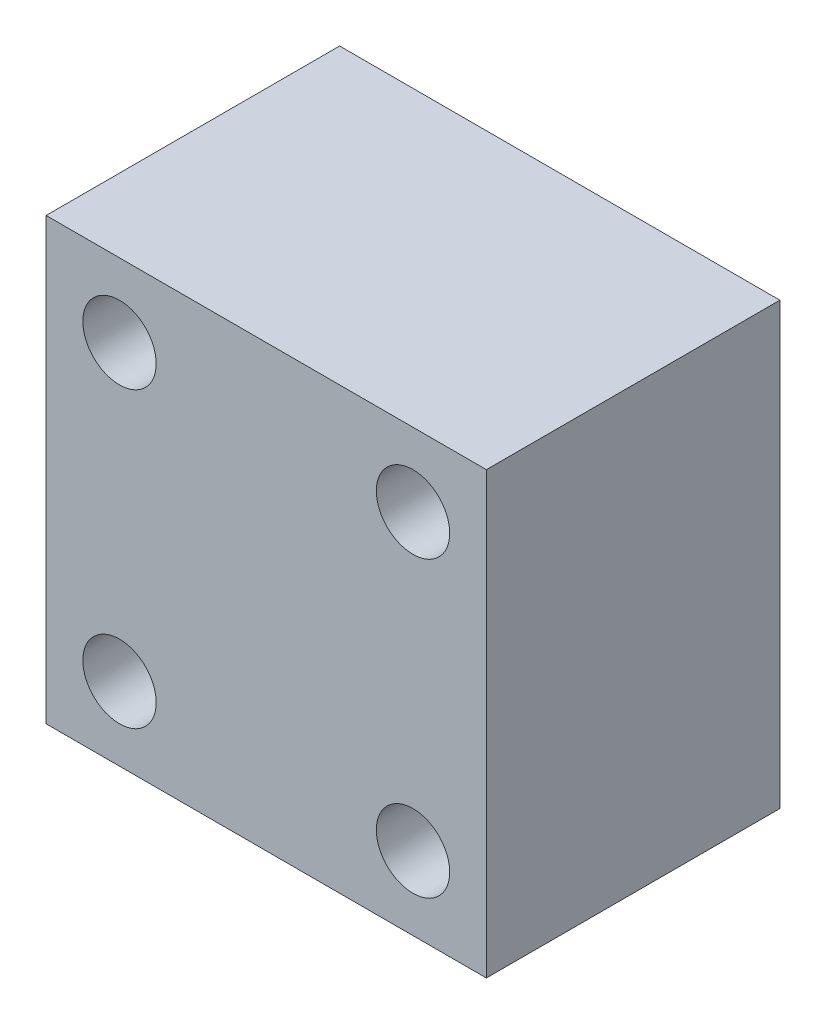
ISO-10303-21;
HEADER;
FILE_DESCRIPTION(('STEP AP214'),'2;1');
FILE_NAME('part.step','',(''),(''),'','','');
FILE_SCHEMA(('AUTOMOTIVE_DESIGN { 1 0 10303 214 1 1 1 1 }'));
ENDSEC;
DATA;
#1=APPLICATION_CONTEXT('core data for automotive mechanical design processes');
#2=APPLICATION_PROTOCOL_DEFINITION('international standard','automotive_design',2000,#1);
#3=PRODUCT_CONTEXT('',#1,'mechanical');
#4=PRODUCT('Part','Part','',(#3));
#5=PRODUCT_RELATED_PRODUCT_CATEGORY('part','',(#4));
#6=PRODUCT_DEFINITION_FORMATION('','',#4);
#7=PRODUCT_DEFINITION_CONTEXT('part definition',#1,'design');
#8=PRODUCT_DEFINITION('design','',#6,#7);
#9=PRODUCT_DEFINITION_SHAPE('','',#8);
#10=(LENGTH_UNIT() NAMED_UNIT(*) SI_UNIT(.MILLI.,.METRE.));
#11=(NAMED_UNIT(*) PLANE_ANGLE_UNIT() SI_UNIT($,.RADIAN.));
#12=(NAMED_UNIT(*) SI_UNIT($,.STERADIAN.) SOLID_ANGLE_UNIT());
#13=UNCERTAINTY_MEASURE_WITH_UNIT(LENGTH_MEASURE(1.E-05),#10,'distance_accuracy_value','');
#14=(GEOMETRIC_REPRESENTATION_CONTEXT(3) GLOBAL_UNCERTAINTY_ASSIGNED_CONTEXT((#13)) GLOBAL_UNIT_ASSIGNED_CONTEXT((#10,
#11,#12)) REPRESENTATION_CONTEXT('',''));
#15=CARTESIAN_POINT('',(0.,0.,0.));
#16=DIRECTION('',(0.,0.,1.));
#17=DIRECTION('',(1.,0.,0.));
#18=AXIS2_PLACEMENT_3D('',#15,#16,#17);
#19=CARTESIAN_POINT('',(0.,0.,40.));
#20=DIRECTION('',(0.,0.,1.));
#21=DIRECTION('',(1.,0.,0.));
#22=AXIS2_PLACEMENT_3D('',#19,#20,#21);
#23=PLANE('',#22);
#24=CARTESIAN_POINT('',(25.4980079681275,12.3505976095618,40.));
#25=DIRECTION('',(0.,0.,1.));
#26=DIRECTION('',(1.,0.,0.));
#27=AXIS2_PLACEMENT_3D('',#24,#25,#26);
#28=CIRCLE('',#27,5.);
#29=CARTESIAN_POINT('',(30.4980079681275,12.3505976095618,40.));
#30=VERTEX_POINT('',#29);
#31=EDGE_CURVE('E129',#30,#30,#28,.F.);
#32=ORIENTED_EDGE('',*,*,#31,.T.);
#33=EDGE_LOOP('',(#32));
#34=FACE_BOUND('',#33,.T.);
#35=CARTESIAN_POINT('',(-14.5019920318725,-27.6494023904383,40.));
#36=DIRECTION('',(0.,0.,1.));
#37=DIRECTION('',(1.,0.,0.));
#38=AXIS2_PLACEMENT_3D('',#35,#36,#37);
#39=CIRCLE('',#38,5.);
#40=CARTESIAN_POINT('',(-9.5019920318725,-27.6494023904383,40.));
#41=VERTEX_POINT('',#40);
#42=EDGE_CURVE('E117',#41,#41,#39,.F.);
#43=ORIENTED_EDGE('',*,*,#42,.T.);
#44=EDGE_LOOP('',(#43));
#45=FACE_BOUND('',#44,.T.);
#46=CARTESIAN_POINT('',(-14.5019920318725,12.3505976095618,40.));
#47=DIRECTION('',(0.,0.,1.));
#48=DIRECTION('',(1.,0.,0.));
#49=AXIS2_PLACEMENT_3D('',#46,#47,#48);
#50=CIRCLE('',#49,5.);
#51=CARTESIAN_POINT('',(-9.5019920318725,12.3505976095618,40.));
#52=VERTEX_POINT('',#51);
#53=EDGE_CURVE('E111',#52,#52,#50,.T.);
#54=ORIENTED_EDGE('',*,*,#53,.F.);
#55=EDGE_LOOP('',(#54));
#56=FACE_BOUND('',#55,.T.);
#57=DIRECTION('',(0.,-1.,0.));
#58=VECTOR('',#57,1.);
#59=CARTESIAN_POINT('',(-24.5019920318725,22.3505976095617,40.));
#60=LINE('',#59,#58);
#61=CARTESIAN_POINT('',(-24.5019920318725,22.3505976095617,40.));
#62=VERTEX_POINT('',#61);
#63=CARTESIAN_POINT('',(-24.5019920318725,-37.6494023904382,40.));
#64=VERTEX_POINT('',#63);
#65=EDGE_CURVE('E85',#62,#64,#60,.T.);
#66=ORIENTED_EDGE('',*,*,#65,.T.);
#67=DIRECTION('',(1.,0.,0.));
#68=VECTOR('',#67,1.);
#69=CARTESIAN_POINT('',(-24.5019920318725,-37.6494023904382,40.));
#70=LINE('',#69,#68);
#71=CARTESIAN_POINT('',(35.4980079681275,-37.6494023904382,40.));
#72=VERTEX_POINT('',#71);
#73=EDGE_CURVE('E80',#64,#72,#70,.T.);
#74=ORIENTED_EDGE('',*,*,#73,.T.);
#75=DIRECTION('',(0.,1.,0.));
#76=VECTOR('',#75,1.);
#77=CARTESIAN_POINT('',(35.4980079681275,22.3505976095617,40.));
#78=LINE('',#77,#76);
#79=CARTESIAN_POINT('',(35.4980079681275,22.3505976095617,40.));
#80=VERTEX_POINT('',#79);
#81=EDGE_CURVE('E83',#72,#80,#78,.T.);
#82=ORIENTED_EDGE('',*,*,#81,.T.);
#83=DIRECTION('',(-1.,0.,0.));
#84=VECTOR('',#83,1.);
#85=CARTESIAN_POINT('',(-24.5019920318725,22.3505976095617,40.));
#86=LINE('',#85,#84);
#87=EDGE_CURVE('E50',#80,#62,#86,.T.);
#88=ORIENTED_EDGE('',*,*,#87,.T.);
#89=EDGE_LOOP('',(#66,#74,#82,#88));
#90=FACE_BOUND('',#89,.T.);
#91=CARTESIAN_POINT('',(25.4980079681275,-27.6494023904383,40.));
#92=DIRECTION('',(0.,0.,1.));
#93=DIRECTION('',(1.,0.,0.));
#94=AXIS2_PLACEMENT_3D('',#91,#92,#93);
#95=CIRCLE('',#94,5.);
#96=CARTESIAN_POINT('',(30.4980079681275,-27.6494023904383,40.));
#97=VERTEX_POINT('',#96);
#98=EDGE_CURVE('E123',#97,#97,#95,.T.);
#99=ORIENTED_EDGE('',*,*,#98,.F.);
#100=EDGE_LOOP('',(#99));
#101=FACE_BOUND('',#100,.T.);
#102=ADVANCED_FACE('F33',(#34,#45,#56,#90,#101),#23,.T.);
#103=CARTESIAN_POINT('',(-24.5019920318725,22.3505976095617,40.));
#104=DIRECTION('',(1.,0.,0.));
#105=DIRECTION('',(0.,0.,-1.));
#106=AXIS2_PLACEMENT_3D('',#103,#104,#105);
#107=PLANE('',#106);
#108=DIRECTION('',(0.,-1.,0.));
#109=VECTOR('',#108,1.);
#110=CARTESIAN_POINT('',(-24.5019920318725,22.3505976095617,0.));
#111=LINE('',#110,#109);
#112=CARTESIAN_POINT('',(-24.5019920318725,22.3505976095617,0.));
#113=VERTEX_POINT('',#112);
#114=CARTESIAN_POINT('',(-24.5019920318725,-37.6494023904382,0.));
#115=VERTEX_POINT('',#114);
#116=EDGE_CURVE('E97',#113,#115,#111,.T.);
#117=ORIENTED_EDGE('',*,*,#116,.T.);
#118=DIRECTION('',(0.,0.,-1.));
#119=VECTOR('',#118,1.);
#120=CARTESIAN_POINT('',(-24.5019920318725,-37.6494023904382,40.));
#121=LINE('',#120,#119);
#122=EDGE_CURVE('E11',#64,#115,#121,.T.);
#123=ORIENTED_EDGE('',*,*,#122,.F.);
#124=ORIENTED_EDGE('',*,*,#65,.F.);
#125=DIRECTION('',(0.,0.,-1.));
#126=VECTOR('',#125,1.);
#127=CARTESIAN_POINT('',(-24.5019920318725,22.3505976095617,40.));
#128=LINE('',#127,#126);
#129=EDGE_CURVE('E93',#62,#113,#128,.T.);
#130=ORIENTED_EDGE('',*,*,#129,.T.);
#131=EDGE_LOOP('',(#117,#123,#124,#130));
#132=FACE_BOUND('',#131,.T.);
#133=ADVANCED_FACE('F35',(#132),#107,.F.);
#134=CARTESIAN_POINT('',(-24.5019920318725,-37.6494023904382,40.));
#135=DIRECTION('',(0.,1.,0.));
#136=DIRECTION('',(0.,0.,1.));
#137=AXIS2_PLACEMENT_3D('',#134,#135,#136);
#138=PLANE('',#137);
#139=DIRECTION('',(1.,0.,0.));
#140=VECTOR('',#139,1.);
#141=CARTESIAN_POINT('',(-24.5019920318725,-37.6494023904382,0.));
#142=LINE('',#141,#140);
#143=CARTESIAN_POINT('',(35.4980079681275,-37.6494023904382,0.));
#144=VERTEX_POINT('',#143);
#145=EDGE_CURVE('E89',#115,#144,#142,.T.);
#146=ORIENTED_EDGE('',*,*,#145,.T.);
#147=DIRECTION('',(0.,0.,-1.));
#148=VECTOR('',#147,1.);
#149=CARTESIAN_POINT('',(35.4980079681275,-37.6494023904382,40.));
#150=LINE('',#149,#148);
#151=EDGE_CURVE('E42',#72,#144,#150,.T.);
#152=ORIENTED_EDGE('',*,*,#151,.F.);
#153=ORIENTED_EDGE('',*,*,#73,.F.);
#154=ORIENTED_EDGE('',*,*,#122,.T.);
#155=EDGE_LOOP('',(#146,#152,#153,#154));
#156=FACE_BOUND('',#155,.T.);
#157=ADVANCED_FACE('F88',(#156),#138,.F.);
#158=CARTESIAN_POINT('',(35.4980079681275,22.3505976095617,40.));
#159=DIRECTION('',(-1.,0.,0.));
#160=DIRECTION('',(0.,-1.,0.));
#161=AXIS2_PLACEMENT_3D('',#158,#159,#160);
#162=PLANE('',#161);
#163=DIRECTION('',(0.,1.,0.));
#164=VECTOR('',#163,1.);
#165=CARTESIAN_POINT('',(35.4980079681275,22.3505976095617,0.));
#166=LINE('',#165,#164);
#167=CARTESIAN_POINT('',(35.4980079681275,22.3505976095617,0.));
#168=VERTEX_POINT('',#167);
#169=EDGE_CURVE('E67',#144,#168,#166,.T.);
#170=ORIENTED_EDGE('',*,*,#169,.T.);
#171=DIRECTION('',(0.,0.,-1.));
#172=VECTOR('',#171,1.);
#173=CARTESIAN_POINT('',(35.4980079681275,22.3505976095617,40.));
#174=LINE('',#173,#172);
#175=EDGE_CURVE('E90',#80,#168,#174,.T.);
#176=ORIENTED_EDGE('',*,*,#175,.F.);
#177=ORIENTED_EDGE('',*,*,#81,.F.);
#178=ORIENTED_EDGE('',*,*,#151,.T.);
#179=EDGE_LOOP('',(#170,#176,#177,#178));
#180=FACE_BOUND('',#179,.T.);
#181=ADVANCED_FACE('F91',(#180),#162,.F.);
#182=CARTESIAN_POINT('',(-24.5019920318725,22.3505976095617,40.));
#183=DIRECTION('',(0.,-1.,0.));
#184=DIRECTION('',(0.,0.,-1.));
#185=AXIS2_PLACEMENT_3D('',#182,#183,#184);
#186=PLANE('',#185);
#187=DIRECTION('',(-1.,0.,0.));
#188=VECTOR('',#187,1.);
#189=CARTESIAN_POINT('',(-24.5019920318725,22.3505976095617,0.));
#190=LINE('',#189,#188);
#191=EDGE_CURVE('E73',#168,#113,#190,.T.);
#192=ORIENTED_EDGE('',*,*,#191,.T.);
#193=ORIENTED_EDGE('',*,*,#129,.F.);
#194=ORIENTED_EDGE('',*,*,#87,.F.);
#195=ORIENTED_EDGE('',*,*,#175,.T.);
#196=EDGE_LOOP('',(#192,#193,#194,#195));
#197=FACE_BOUND('',#196,.T.);
#198=ADVANCED_FACE('F105',(#197),#186,.F.);
#199=CARTESIAN_POINT('',(0.,0.,0.));
#200=DIRECTION('',(0.,0.,1.));
#201=DIRECTION('',(1.,0.,0.));
#202=AXIS2_PLACEMENT_3D('',#199,#200,#201);
#203=PLANE('',#202);
#204=ORIENTED_EDGE('',*,*,#116,.F.);
#205=ORIENTED_EDGE('',*,*,#191,.F.);
#206=ORIENTED_EDGE('',*,*,#169,.F.);
#207=ORIENTED_EDGE('',*,*,#145,.F.);
#208=EDGE_LOOP('',(#204,#205,#206,#207));
#209=FACE_BOUND('',#208,.T.);
#210=ADVANCED_FACE('F108',(#209),#203,.F.);
#211=CARTESIAN_POINT('',(-14.5019920318725,12.3505976095618,20.));
#212=DIRECTION('',(0.,0.,1.));
#213=DIRECTION('',(1.,0.,0.));
#214=AXIS2_PLACEMENT_3D('',#211,#212,#213);
#215=CYLINDRICAL_SURFACE('',#214,5.);
#216=CARTESIAN_POINT('',(-14.5019920318725,12.3505976095618,20.));
#217=DIRECTION('',(0.,0.,1.));
#218=DIRECTION('',(1.,0.,0.));
#219=AXIS2_PLACEMENT_3D('',#216,#217,#218);
#220=CIRCLE('',#219,5.);
#221=CARTESIAN_POINT('',(-9.5019920318725,12.3505976095618,20.));
#222=VERTEX_POINT('',#221);
#223=EDGE_CURVE('E100',#222,#222,#220,.T.);
#224=ORIENTED_EDGE('',*,*,#223,.F.);
#225=EDGE_LOOP('',(#224));
#226=FACE_BOUND('',#225,.T.);
#227=ORIENTED_EDGE('',*,*,#53,.T.);
#228=EDGE_LOOP('',(#227));
#229=FACE_BOUND('',#228,.T.);
#230=ADVANCED_FACE('F155',(#226,#229),#215,.F.);
#231=CARTESIAN_POINT('',(0.,0.,20.));
#232=DIRECTION('',(0.,0.,1.));
#233=DIRECTION('',(1.,0.,0.));
#234=AXIS2_PLACEMENT_3D('',#231,#232,#233);
#235=PLANE('',#234);
#236=ORIENTED_EDGE('',*,*,#223,.T.);
#237=EDGE_LOOP('',(#236));
#238=FACE_BOUND('',#237,.T.);
#239=ADVANCED_FACE('F185',(#238),#235,.T.);
#240=CARTESIAN_POINT('',(-14.5019920318725,-27.6494023904383,20.));
#241=DIRECTION('',(0.,0.,1.));
#242=DIRECTION('',(1.,0.,0.));
#243=AXIS2_PLACEMENT_3D('',#240,#241,#242);
#244=CYLINDRICAL_SURFACE('',#243,5.);
#245=CARTESIAN_POINT('',(-14.5019920318725,-27.6494023904383,20.));
#246=DIRECTION('',(0.,0.,1.));
#247=DIRECTION('',(1.,0.,0.));
#248=AXIS2_PLACEMENT_3D('',#245,#246,#247);
#249=CIRCLE('',#248,5.);
#250=CARTESIAN_POINT('',(-9.5019920318725,-27.6494023904383,20.));
#251=VERTEX_POINT('',#250);
#252=EDGE_CURVE('E120',#251,#251,#249,.F.);
#253=ORIENTED_EDGE('',*,*,#252,.T.);
#254=EDGE_LOOP('',(#253));
#255=FACE_BOUND('',#254,.T.);
#256=ORIENTED_EDGE('',*,*,#42,.F.);
#257=EDGE_LOOP('',(#256));
#258=FACE_BOUND('',#257,.T.);
#259=ADVANCED_FACE('F192',(#255,#258),#244,.F.);
#260=CARTESIAN_POINT('',(0.,0.,20.));
#261=DIRECTION('',(0.,0.,1.));
#262=DIRECTION('',(1.,0.,0.));
#263=AXIS2_PLACEMENT_3D('',#260,#261,#262);
#264=PLANE('',#263);
#265=ORIENTED_EDGE('',*,*,#252,.F.);
#266=EDGE_LOOP('',(#265));
#267=FACE_BOUND('',#266,.T.);
#268=ADVANCED_FACE('F199',(#267),#264,.T.);
#269=CARTESIAN_POINT('',(25.4980079681275,-27.6494023904383,20.));
#270=DIRECTION('',(0.,0.,1.));
#271=DIRECTION('',(1.,0.,0.));
#272=AXIS2_PLACEMENT_3D('',#269,#270,#271);
#273=CYLINDRICAL_SURFACE('',#272,5.);
#274=CARTESIAN_POINT('',(25.4980079681275,-27.6494023904383,20.));
#275=DIRECTION('',(0.,0.,1.));
#276=DIRECTION('',(1.,0.,0.));
#277=AXIS2_PLACEMENT_3D('',#274,#275,#276);
#278=CIRCLE('',#277,5.);
#279=CARTESIAN_POINT('',(30.4980079681275,-27.6494023904383,20.));
#280=VERTEX_POINT('',#279);
#281=EDGE_CURVE('E126',#280,#280,#278,.T.);
#282=ORIENTED_EDGE('',*,*,#281,.F.);
#283=EDGE_LOOP('',(#282));
#284=FACE_BOUND('',#283,.T.);
#285=ORIENTED_EDGE('',*,*,#98,.T.);
#286=EDGE_LOOP('',(#285));
#287=FACE_BOUND('',#286,.T.);
#288=ADVANCED_FACE('F207',(#284,#287),#273,.F.);
#289=CARTESIAN_POINT('',(0.,0.,20.));
#290=DIRECTION('',(0.,0.,1.));
#291=DIRECTION('',(1.,0.,0.));
#292=AXIS2_PLACEMENT_3D('',#289,#290,#291);
#293=PLANE('',#292);
#294=ORIENTED_EDGE('',*,*,#281,.T.);
#295=EDGE_LOOP('',(#294));
#296=FACE_BOUND('',#295,.T.);
#297=ADVANCED_FACE('F144',(#296),#293,.T.);
#298=CARTESIAN_POINT('',(25.4980079681275,12.3505976095618,20.));
#299=DIRECTION('',(0.,0.,1.));
#300=DIRECTION('',(1.,0.,0.));
#301=AXIS2_PLACEMENT_3D('',#298,#299,#300);
#302=CYLINDRICAL_SURFACE('',#301,5.);
#303=CARTESIAN_POINT('',(25.4980079681275,12.3505976095618,20.));
#304=DIRECTION('',(0.,0.,1.));
#305=DIRECTION('',(1.,0.,0.));
#306=AXIS2_PLACEMENT_3D('',#303,#304,#305);
#307=CIRCLE('',#306,5.);
#308=CARTESIAN_POINT('',(30.4980079681275,12.3505976095618,20.));
#309=VERTEX_POINT('',#308);
#310=EDGE_CURVE('E114',#309,#309,#307,.F.);
#311=ORIENTED_EDGE('',*,*,#310,.T.);
#312=EDGE_LOOP('',(#311));
#313=FACE_BOUND('',#312,.T.);
#314=ORIENTED_EDGE('',*,*,#31,.F.);
#315=EDGE_LOOP('',(#314));
#316=FACE_BOUND('',#315,.T.);
#317=ADVANCED_FACE('F135',(#313,#316),#302,.F.);
#318=CARTESIAN_POINT('',(0.,0.,20.));
#319=DIRECTION('',(0.,0.,1.));
#320=DIRECTION('',(1.,0.,0.));
#321=AXIS2_PLACEMENT_3D('',#318,#319,#320);
#322=PLANE('',#321);
#323=ORIENTED_EDGE('',*,*,#310,.F.);
#324=EDGE_LOOP('',(#323));
#325=FACE_BOUND('',#324,.T.);
#326=ADVANCED_FACE('F138',(#325),#322,.T.);
#327=CLOSED_SHELL('',(#102,#133,#157,#181,#198,#210,#230,#239,#259,#268,#288,#297,#317,#326));
#328=MANIFOLD_SOLID_BREP('B2',#327);
#329=ADVANCED_BREP_SHAPE_REPRESENTATION('',(#18,#328),#14);
#330=SHAPE_DEFINITION_REPRESENTATION(#9,#329);
ENDSEC;
END-ISO-10303-21;
